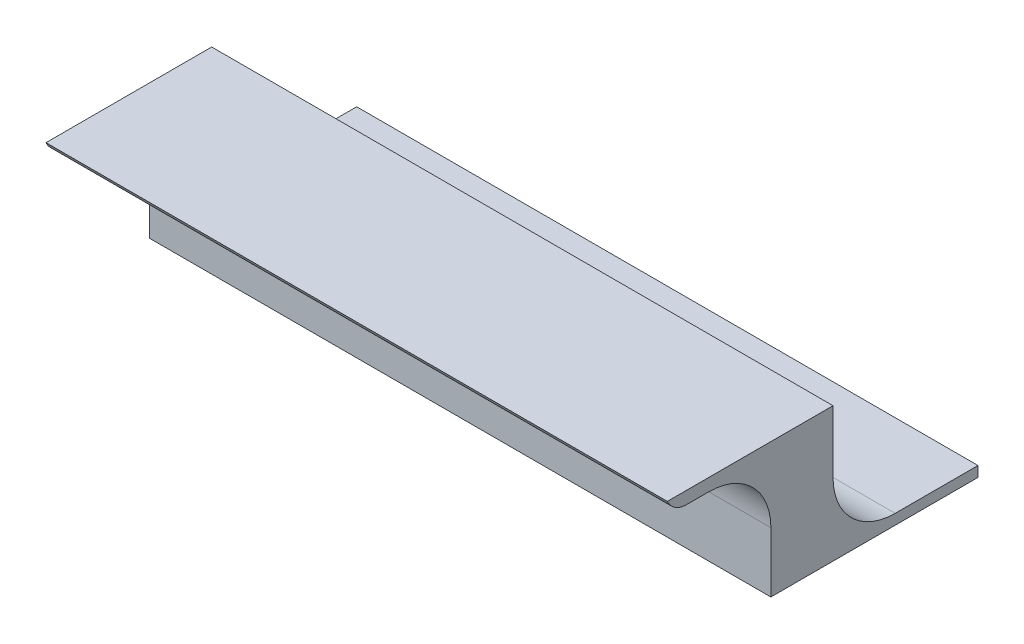
ISO-10303-21;
HEADER;
FILE_DESCRIPTION(('STEP AP214'),'2;1');
FILE_NAME('part.step','',(''),(''),'','','');
FILE_SCHEMA(('AUTOMOTIVE_DESIGN { 1 0 10303 214 1 1 1 1 }'));
ENDSEC;
DATA;
#1=APPLICATION_CONTEXT('core data for automotive mechanical design processes');
#2=APPLICATION_PROTOCOL_DEFINITION('international standard','automotive_design',2000,#1);
#3=PRODUCT_CONTEXT('',#1,'mechanical');
#4=PRODUCT('Part','Part','',(#3));
#5=PRODUCT_RELATED_PRODUCT_CATEGORY('part','',(#4));
#6=PRODUCT_DEFINITION_FORMATION('','',#4);
#7=PRODUCT_DEFINITION_CONTEXT('part definition',#1,'design');
#8=PRODUCT_DEFINITION('design','',#6,#7);
#9=PRODUCT_DEFINITION_SHAPE('','',#8);
#10=(LENGTH_UNIT() NAMED_UNIT(*) SI_UNIT(.MILLI.,.METRE.));
#11=(NAMED_UNIT(*) PLANE_ANGLE_UNIT() SI_UNIT($,.RADIAN.));
#12=(NAMED_UNIT(*) SI_UNIT($,.STERADIAN.) SOLID_ANGLE_UNIT());
#13=UNCERTAINTY_MEASURE_WITH_UNIT(LENGTH_MEASURE(1.E-05),#10,'distance_accuracy_value','');
#14=(GEOMETRIC_REPRESENTATION_CONTEXT(3) GLOBAL_UNCERTAINTY_ASSIGNED_CONTEXT((#13)) GLOBAL_UNIT_ASSIGNED_CONTEXT((#10,
#11,#12)) REPRESENTATION_CONTEXT('',''));
#15=CARTESIAN_POINT('',(0.,0.,0.));
#16=DIRECTION('',(0.,0.,1.));
#17=DIRECTION('',(1.,0.,0.));
#18=AXIS2_PLACEMENT_3D('',#15,#16,#17);
#19=CARTESIAN_POINT('',(15.,0.5,5.));
#20=DIRECTION('',(0.,0.,-1.));
#21=DIRECTION('',(-1.,0.,0.));
#22=AXIS2_PLACEMENT_3D('',#19,#20,#21);
#23=PLANE('',#22);
#24=DIRECTION('',(0.,-1.,0.));
#25=VECTOR('',#24,1.);
#26=CARTESIAN_POINT('',(15.,0.5,5.));
#27=LINE('',#26,#25);
#28=CARTESIAN_POINT('',(15.,2.9,5.));
#29=VERTEX_POINT('',#28);
#30=CARTESIAN_POINT('',(15.,0.,5.));
#31=VERTEX_POINT('',#30);
#32=EDGE_CURVE('E191',#29,#31,#27,.T.);
#33=ORIENTED_EDGE('',*,*,#32,.F.);
#34=DIRECTION('',(1.,0.,0.));
#35=VECTOR('',#34,1.);
#36=CARTESIAN_POINT('',(-15.,2.9,5.));
#37=LINE('',#36,#35);
#38=CARTESIAN_POINT('',(-15.,2.9,5.));
#39=VERTEX_POINT('',#38);
#40=EDGE_CURVE('E208',#29,#39,#37,.F.);
#41=ORIENTED_EDGE('',*,*,#40,.T.);
#42=DIRECTION('',(0.,-1.,0.));
#43=VECTOR('',#42,1.);
#44=CARTESIAN_POINT('',(-15.,0.5,5.));
#45=LINE('',#44,#43);
#46=CARTESIAN_POINT('',(-15.,0.,5.));
#47=VERTEX_POINT('',#46);
#48=EDGE_CURVE('E194',#39,#47,#45,.T.);
#49=ORIENTED_EDGE('',*,*,#48,.T.);
#50=DIRECTION('',(1.,0.,0.));
#51=VECTOR('',#50,1.);
#52=CARTESIAN_POINT('',(15.,0.,5.));
#53=LINE('',#52,#51);
#54=EDGE_CURVE('E175',#47,#31,#53,.T.);
#55=ORIENTED_EDGE('',*,*,#54,.T.);
#56=EDGE_LOOP('',(#33,#41,#49,#55));
#57=FACE_BOUND('',#56,.T.);
#58=ADVANCED_FACE('F45',(#57),#23,.F.);
#59=CARTESIAN_POINT('',(0.,0.5,0.));
#60=DIRECTION('',(0.,-1.,0.));
#61=DIRECTION('',(0.,0.,-1.));
#62=AXIS2_PLACEMENT_3D('',#59,#60,#61);
#63=PLANE('',#62);
#64=DIRECTION('',(0.,0.,1.));
#65=VECTOR('',#64,1.);
#66=CARTESIAN_POINT('',(-15.,0.5,-5.));
#67=LINE('',#66,#65);
#68=CARTESIAN_POINT('',(-15.,0.5,-5.));
#69=VERTEX_POINT('',#68);
#70=CARTESIAN_POINT('',(-15.,0.5,-0.999999999999997));
#71=VERTEX_POINT('',#70);
#72=EDGE_CURVE('E161',#69,#71,#67,.T.);
#73=ORIENTED_EDGE('',*,*,#72,.T.);
#74=DIRECTION('',(-1.,0.,0.));
#75=VECTOR('',#74,1.);
#76=CARTESIAN_POINT('',(15.,0.5,-0.999999999999997));
#77=LINE('',#76,#75);
#78=CARTESIAN_POINT('',(15.,0.5,-0.999999999999997));
#79=VERTEX_POINT('',#78);
#80=EDGE_CURVE('E201',#71,#79,#77,.F.);
#81=ORIENTED_EDGE('',*,*,#80,.T.);
#82=DIRECTION('',(0.,0.,-1.));
#83=VECTOR('',#82,1.);
#84=CARTESIAN_POINT('',(15.,0.5,-5.));
#85=LINE('',#84,#83);
#86=CARTESIAN_POINT('',(15.,0.5,-5.));
#87=VERTEX_POINT('',#86);
#88=EDGE_CURVE('E165',#79,#87,#85,.T.);
#89=ORIENTED_EDGE('',*,*,#88,.T.);
#90=DIRECTION('',(-1.,0.,0.));
#91=VECTOR('',#90,1.);
#92=CARTESIAN_POINT('',(15.,0.5,-5.));
#93=LINE('',#92,#91);
#94=EDGE_CURVE('E169',#87,#69,#93,.T.);
#95=ORIENTED_EDGE('',*,*,#94,.T.);
#96=EDGE_LOOP('',(#73,#81,#89,#95));
#97=FACE_BOUND('',#96,.T.);
#98=ADVANCED_FACE('F251',(#97),#63,.F.);
#99=CARTESIAN_POINT('',(-15.,0.5,-5.));
#100=DIRECTION('',(1.,0.,0.));
#101=DIRECTION('',(0.,0.,-1.));
#102=AXIS2_PLACEMENT_3D('',#99,#100,#101);
#103=PLANE('',#102);
#104=DIRECTION('',(0.,0.,-1.));
#105=VECTOR('',#104,1.);
#106=CARTESIAN_POINT('',(-15.,5.9,10.));
#107=LINE('',#106,#105);
#108=CARTESIAN_POINT('',(-15.,5.9,9.08348486100883));
#109=VERTEX_POINT('',#108);
#110=CARTESIAN_POINT('',(-15.,5.9,8.));
#111=VERTEX_POINT('',#110);
#112=EDGE_CURVE('E145',#109,#111,#107,.T.);
#113=ORIENTED_EDGE('',*,*,#112,.F.);
#114=CARTESIAN_POINT('',(-15.,6.9,9.08348486100883));
#115=DIRECTION('',(1.,0.,0.));
#116=DIRECTION('',(0.,0.,-1.));
#117=AXIS2_PLACEMENT_3D('',#114,#115,#116);
#118=CIRCLE('',#117,1.);
#119=CARTESIAN_POINT('',(-15.,6.5,10.));
#120=VERTEX_POINT('',#119);
#121=EDGE_CURVE('E11',#109,#120,#118,.F.);
#122=ORIENTED_EDGE('',*,*,#121,.T.);
#123=DIRECTION('',(0.,0.,1.));
#124=VECTOR('',#123,1.);
#125=CARTESIAN_POINT('',(-15.,6.5,5.));
#126=LINE('',#125,#124);
#127=CARTESIAN_POINT('',(-15.,6.5,2.));
#128=VERTEX_POINT('',#127);
#129=EDGE_CURVE('E135',#128,#120,#126,.T.);
#130=ORIENTED_EDGE('',*,*,#129,.F.);
#131=DIRECTION('',(0.,-1.,0.));
#132=VECTOR('',#131,1.);
#133=CARTESIAN_POINT('',(-15.,6.5,2.));
#134=LINE('',#133,#132);
#135=CARTESIAN_POINT('',(-15.,3.5,2.));
#136=VERTEX_POINT('',#135);
#137=EDGE_CURVE('E154',#128,#136,#134,.T.);
#138=ORIENTED_EDGE('',*,*,#137,.T.);
#139=CARTESIAN_POINT('',(-15.,3.5,-0.999999999999997));
#140=DIRECTION('',(1.,0.,0.));
#141=DIRECTION('',(0.,0.,-1.));
#142=AXIS2_PLACEMENT_3D('',#139,#140,#141);
#143=CIRCLE('',#142,3.);
#144=EDGE_CURVE('E211',#136,#71,#143,.T.);
#145=ORIENTED_EDGE('',*,*,#144,.T.);
#146=ORIENTED_EDGE('',*,*,#72,.F.);
#147=DIRECTION('',(0.,-1.,0.));
#148=VECTOR('',#147,1.);
#149=CARTESIAN_POINT('',(-15.,0.5,-5.));
#150=LINE('',#149,#148);
#151=CARTESIAN_POINT('',(-15.,0.,-5.));
#152=VERTEX_POINT('',#151);
#153=EDGE_CURVE('E172',#69,#152,#150,.T.);
#154=ORIENTED_EDGE('',*,*,#153,.T.);
#155=DIRECTION('',(0.,0.,1.));
#156=VECTOR('',#155,1.);
#157=CARTESIAN_POINT('',(-15.,0.,-5.));
#158=LINE('',#157,#156);
#159=EDGE_CURVE('E160',#152,#47,#158,.T.);
#160=ORIENTED_EDGE('',*,*,#159,.T.);
#161=ORIENTED_EDGE('',*,*,#48,.F.);
#162=CARTESIAN_POINT('',(-15.,2.9,8.));
#163=DIRECTION('',(1.,0.,0.));
#164=DIRECTION('',(0.,0.,-1.));
#165=AXIS2_PLACEMENT_3D('',#162,#163,#164);
#166=CIRCLE('',#165,3.);
#167=EDGE_CURVE('E124',#39,#111,#166,.T.);
#168=ORIENTED_EDGE('',*,*,#167,.T.);
#169=EDGE_LOOP('',(#113,#122,#130,#138,#145,#146,#154,#160,#161,#168));
#170=FACE_BOUND('',#169,.T.);
#171=ADVANCED_FACE('F229',(#170),#103,.F.);
#172=CARTESIAN_POINT('',(15.,0.5,-5.));
#173=DIRECTION('',(-1.,0.,0.));
#174=DIRECTION('',(0.,0.,1.));
#175=AXIS2_PLACEMENT_3D('',#172,#173,#174);
#176=PLANE('',#175);
#177=DIRECTION('',(0.,0.,-1.));
#178=VECTOR('',#177,1.);
#179=CARTESIAN_POINT('',(15.,6.5,5.));
#180=LINE('',#179,#178);
#181=CARTESIAN_POINT('',(15.,6.5,10.));
#182=VERTEX_POINT('',#181);
#183=CARTESIAN_POINT('',(15.,6.5,2.));
#184=VERTEX_POINT('',#183);
#185=EDGE_CURVE('E127',#182,#184,#180,.T.);
#186=ORIENTED_EDGE('',*,*,#185,.F.);
#187=CARTESIAN_POINT('',(15.,6.9,9.08348486100883));
#188=DIRECTION('',(-1.,0.,0.));
#189=DIRECTION('',(0.,0.,1.));
#190=AXIS2_PLACEMENT_3D('',#187,#188,#189);
#191=CIRCLE('',#190,1.);
#192=CARTESIAN_POINT('',(15.,5.9,9.08348486100883));
#193=VERTEX_POINT('',#192);
#194=EDGE_CURVE('E68',#182,#193,#191,.F.);
#195=ORIENTED_EDGE('',*,*,#194,.T.);
#196=DIRECTION('',(0.,0.,-1.));
#197=VECTOR('',#196,1.);
#198=CARTESIAN_POINT('',(15.,5.9,10.));
#199=LINE('',#198,#197);
#200=CARTESIAN_POINT('',(15.,5.9,8.));
#201=VERTEX_POINT('',#200);
#202=EDGE_CURVE('E141',#193,#201,#199,.T.);
#203=ORIENTED_EDGE('',*,*,#202,.T.);
#204=CARTESIAN_POINT('',(15.,2.9,8.));
#205=DIRECTION('',(-1.,0.,0.));
#206=DIRECTION('',(0.,0.,1.));
#207=AXIS2_PLACEMENT_3D('',#204,#205,#206);
#208=CIRCLE('',#207,3.);
#209=EDGE_CURVE('E217',#201,#29,#208,.T.);
#210=ORIENTED_EDGE('',*,*,#209,.T.);
#211=ORIENTED_EDGE('',*,*,#32,.T.);
#212=DIRECTION('',(0.,0.,-1.));
#213=VECTOR('',#212,1.);
#214=CARTESIAN_POINT('',(15.,0.,-5.));
#215=LINE('',#214,#213);
#216=CARTESIAN_POINT('',(15.,0.,-5.));
#217=VERTEX_POINT('',#216);
#218=EDGE_CURVE('E179',#31,#217,#215,.T.);
#219=ORIENTED_EDGE('',*,*,#218,.T.);
#220=DIRECTION('',(0.,-1.,0.));
#221=VECTOR('',#220,1.);
#222=CARTESIAN_POINT('',(15.,0.5,-5.));
#223=LINE('',#222,#221);
#224=EDGE_CURVE('E187',#87,#217,#223,.T.);
#225=ORIENTED_EDGE('',*,*,#224,.F.);
#226=ORIENTED_EDGE('',*,*,#88,.F.);
#227=CARTESIAN_POINT('',(15.,3.5,-0.999999999999997));
#228=DIRECTION('',(-1.,0.,0.));
#229=DIRECTION('',(0.,0.,1.));
#230=AXIS2_PLACEMENT_3D('',#227,#228,#229);
#231=CIRCLE('',#230,3.);
#232=CARTESIAN_POINT('',(15.,3.5,2.));
#233=VERTEX_POINT('',#232);
#234=EDGE_CURVE('E214',#79,#233,#231,.T.);
#235=ORIENTED_EDGE('',*,*,#234,.T.);
#236=DIRECTION('',(0.,-1.,0.));
#237=VECTOR('',#236,1.);
#238=CARTESIAN_POINT('',(15.,6.5,2.));
#239=LINE('',#238,#237);
#240=EDGE_CURVE('E130',#184,#233,#239,.T.);
#241=ORIENTED_EDGE('',*,*,#240,.F.);
#242=EDGE_LOOP('',(#186,#195,#203,#210,#211,#219,#225,#226,#235,#241));
#243=FACE_BOUND('',#242,.T.);
#244=ADVANCED_FACE('F128',(#243),#176,.F.);
#245=CARTESIAN_POINT('',(15.,0.5,-5.));
#246=DIRECTION('',(0.,0.,1.));
#247=DIRECTION('',(1.,0.,0.));
#248=AXIS2_PLACEMENT_3D('',#245,#246,#247);
#249=PLANE('',#248);
#250=DIRECTION('',(-1.,0.,0.));
#251=VECTOR('',#250,1.);
#252=CARTESIAN_POINT('',(15.,0.,-5.));
#253=LINE('',#252,#251);
#254=EDGE_CURVE('E166',#217,#152,#253,.T.);
#255=ORIENTED_EDGE('',*,*,#254,.T.);
#256=ORIENTED_EDGE('',*,*,#153,.F.);
#257=ORIENTED_EDGE('',*,*,#94,.F.);
#258=ORIENTED_EDGE('',*,*,#224,.T.);
#259=EDGE_LOOP('',(#255,#256,#257,#258));
#260=FACE_BOUND('',#259,.T.);
#261=ADVANCED_FACE('F247',(#260),#249,.F.);
#262=CARTESIAN_POINT('',(0.,0.,0.));
#263=DIRECTION('',(0.,-1.,0.));
#264=DIRECTION('',(0.,0.,-1.));
#265=AXIS2_PLACEMENT_3D('',#262,#263,#264);
#266=PLANE('',#265);
#267=ORIENTED_EDGE('',*,*,#159,.F.);
#268=ORIENTED_EDGE('',*,*,#254,.F.);
#269=ORIENTED_EDGE('',*,*,#218,.F.);
#270=ORIENTED_EDGE('',*,*,#54,.F.);
#271=EDGE_LOOP('',(#267,#268,#269,#270));
#272=FACE_BOUND('',#271,.T.);
#273=ADVANCED_FACE('F242',(#272),#266,.T.);
#274=CARTESIAN_POINT('',(-15.,6.5,2.));
#275=DIRECTION('',(0.,0.,1.));
#276=DIRECTION('',(1.,0.,0.));
#277=AXIS2_PLACEMENT_3D('',#274,#275,#276);
#278=PLANE('',#277);
#279=ORIENTED_EDGE('',*,*,#240,.T.);
#280=DIRECTION('',(-1.,0.,0.));
#281=VECTOR('',#280,1.);
#282=CARTESIAN_POINT('',(-15.,3.5,2.));
#283=LINE('',#282,#281);
#284=EDGE_CURVE('E197',#233,#136,#283,.T.);
#285=ORIENTED_EDGE('',*,*,#284,.T.);
#286=ORIENTED_EDGE('',*,*,#137,.F.);
#287=DIRECTION('',(-1.,0.,0.));
#288=VECTOR('',#287,1.);
#289=CARTESIAN_POINT('',(-15.,6.5,2.));
#290=LINE('',#289,#288);
#291=EDGE_CURVE('E134',#184,#128,#290,.T.);
#292=ORIENTED_EDGE('',*,*,#291,.F.);
#293=EDGE_LOOP('',(#279,#285,#286,#292));
#294=FACE_BOUND('',#293,.T.);
#295=ADVANCED_FACE('F259',(#294),#278,.F.);
#296=CARTESIAN_POINT('',(0.,6.5,0.));
#297=DIRECTION('',(0.,-1.,0.));
#298=DIRECTION('',(0.,0.,-1.));
#299=AXIS2_PLACEMENT_3D('',#296,#297,#298);
#300=PLANE('',#299);
#301=ORIENTED_EDGE('',*,*,#129,.T.);
#302=DIRECTION('',(-1.,0.,0.));
#303=VECTOR('',#302,1.);
#304=CARTESIAN_POINT('',(-15.,6.5,10.));
#305=LINE('',#304,#303);
#306=EDGE_CURVE('E122',#182,#120,#305,.T.);
#307=ORIENTED_EDGE('',*,*,#306,.F.);
#308=ORIENTED_EDGE('',*,*,#185,.T.);
#309=ORIENTED_EDGE('',*,*,#291,.T.);
#310=EDGE_LOOP('',(#301,#307,#308,#309));
#311=FACE_BOUND('',#310,.T.);
#312=ADVANCED_FACE('F138',(#311),#300,.F.);
#313=CARTESIAN_POINT('',(-15.,5.9,10.));
#314=DIRECTION('',(0.,1.,0.));
#315=DIRECTION('',(0.,0.,1.));
#316=AXIS2_PLACEMENT_3D('',#313,#314,#315);
#317=PLANE('',#316);
#318=ORIENTED_EDGE('',*,*,#202,.F.);
#319=DIRECTION('',(1.,0.,0.));
#320=VECTOR('',#319,1.);
#321=CARTESIAN_POINT('',(-15.,5.9,9.08348486100883));
#322=LINE('',#321,#320);
#323=EDGE_CURVE('E54',#193,#109,#322,.F.);
#324=ORIENTED_EDGE('',*,*,#323,.T.);
#325=ORIENTED_EDGE('',*,*,#112,.T.);
#326=DIRECTION('',(1.,0.,0.));
#327=VECTOR('',#326,1.);
#328=CARTESIAN_POINT('',(15.,5.9,8.));
#329=LINE('',#328,#327);
#330=EDGE_CURVE('E204',#111,#201,#329,.T.);
#331=ORIENTED_EDGE('',*,*,#330,.T.);
#332=EDGE_LOOP('',(#318,#324,#325,#331));
#333=FACE_BOUND('',#332,.T.);
#334=ADVANCED_FACE('F234',(#333),#317,.F.);
#335=CARTESIAN_POINT('',(-15.,3.5,-0.999999999999997));
#336=DIRECTION('',(1.,0.,0.));
#337=DIRECTION('',(0.,0.,-1.));
#338=AXIS2_PLACEMENT_3D('',#335,#336,#337);
#339=CYLINDRICAL_SURFACE('',#338,3.);
#340=ORIENTED_EDGE('',*,*,#234,.F.);
#341=ORIENTED_EDGE('',*,*,#80,.F.);
#342=ORIENTED_EDGE('',*,*,#144,.F.);
#343=ORIENTED_EDGE('',*,*,#284,.F.);
#344=EDGE_LOOP('',(#340,#341,#342,#343));
#345=FACE_BOUND('',#344,.T.);
#346=ADVANCED_FACE('F256',(#345),#339,.F.);
#347=CARTESIAN_POINT('',(-15.,2.9,8.));
#348=DIRECTION('',(-1.,0.,0.));
#349=DIRECTION('',(0.,0.,1.));
#350=AXIS2_PLACEMENT_3D('',#347,#348,#349);
#351=CYLINDRICAL_SURFACE('',#350,3.);
#352=ORIENTED_EDGE('',*,*,#167,.F.);
#353=ORIENTED_EDGE('',*,*,#40,.F.);
#354=ORIENTED_EDGE('',*,*,#209,.F.);
#355=ORIENTED_EDGE('',*,*,#330,.F.);
#356=EDGE_LOOP('',(#352,#353,#354,#355));
#357=FACE_BOUND('',#356,.T.);
#358=ADVANCED_FACE('F233',(#357),#351,.F.);
#359=CARTESIAN_POINT('',(0.,6.9,9.08348486100883));
#360=DIRECTION('',(1.,0.,0.));
#361=DIRECTION('',(0.,0.,-1.));
#362=AXIS2_PLACEMENT_3D('',#359,#360,#361);
#363=CYLINDRICAL_SURFACE('',#362,1.);
#364=ORIENTED_EDGE('',*,*,#121,.F.);
#365=ORIENTED_EDGE('',*,*,#323,.F.);
#366=ORIENTED_EDGE('',*,*,#194,.F.);
#367=ORIENTED_EDGE('',*,*,#306,.T.);
#368=EDGE_LOOP('',(#364,#365,#366,#367));
#369=FACE_BOUND('',#368,.T.);
#370=ADVANCED_FACE('F47',(#369),#363,.T.);
#371=CLOSED_SHELL('',(#58,#98,#171,#244,#261,#273,#295,#312,#334,#346,#358,#370));
#372=MANIFOLD_SOLID_BREP('B2',#371);
#373=ADVANCED_BREP_SHAPE_REPRESENTATION('',(#18,#372),#14);
#374=SHAPE_DEFINITION_REPRESENTATION(#9,#373);
ENDSEC;
END-ISO-10303-21;
